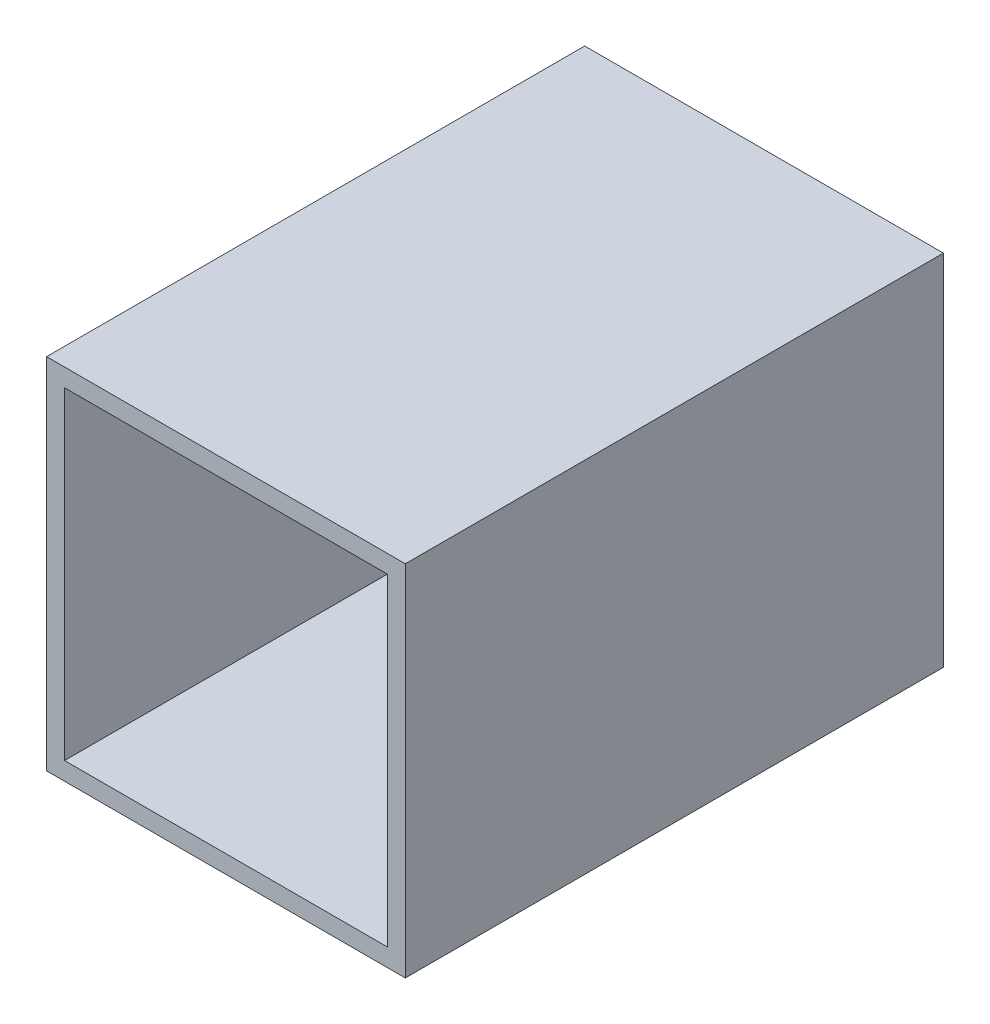
ISO-10303-21;
HEADER;
FILE_DESCRIPTION(('STEP AP214'),'2;1');
FILE_NAME('part.step','',(''),(''),'','','');
FILE_SCHEMA(('AUTOMOTIVE_DESIGN { 1 0 10303 214 1 1 1 1 }'));
ENDSEC;
DATA;
#1=APPLICATION_CONTEXT('core data for automotive mechanical design processes');
#2=APPLICATION_PROTOCOL_DEFINITION('international standard','automotive_design',2000,#1);
#3=PRODUCT_CONTEXT('',#1,'mechanical');
#4=PRODUCT('Part','Part','',(#3));
#5=PRODUCT_RELATED_PRODUCT_CATEGORY('part','',(#4));
#6=PRODUCT_DEFINITION_FORMATION('','',#4);
#7=PRODUCT_DEFINITION_CONTEXT('part definition',#1,'design');
#8=PRODUCT_DEFINITION('design','',#6,#7);
#9=PRODUCT_DEFINITION_SHAPE('','',#8);
#10=(LENGTH_UNIT() NAMED_UNIT(*) SI_UNIT(.MILLI.,.METRE.));
#11=(NAMED_UNIT(*) PLANE_ANGLE_UNIT() SI_UNIT($,.RADIAN.));
#12=(NAMED_UNIT(*) SI_UNIT($,.STERADIAN.) SOLID_ANGLE_UNIT());
#13=UNCERTAINTY_MEASURE_WITH_UNIT(LENGTH_MEASURE(1.E-05),#10,'distance_accuracy_value','');
#14=(GEOMETRIC_REPRESENTATION_CONTEXT(3) GLOBAL_UNCERTAINTY_ASSIGNED_CONTEXT((#13)) GLOBAL_UNIT_ASSIGNED_CONTEXT((#10,
#11,#12)) REPRESENTATION_CONTEXT('',''));
#15=CARTESIAN_POINT('',(0.,0.,0.));
#16=DIRECTION('',(0.,0.,1.));
#17=DIRECTION('',(1.,0.,0.));
#18=AXIS2_PLACEMENT_3D('',#15,#16,#17);
#19=CARTESIAN_POINT('',(0.,0.,30.));
#20=DIRECTION('',(0.,0.,1.));
#21=DIRECTION('',(1.,0.,0.));
#22=AXIS2_PLACEMENT_3D('',#19,#20,#21);
#23=PLANE('',#22);
#24=DIRECTION('',(0.,-1.,0.));
#25=VECTOR('',#24,1.);
#26=CARTESIAN_POINT('',(-10.,-10.,30.));
#27=LINE('',#26,#25);
#28=CARTESIAN_POINT('',(-10.,10.,30.));
#29=VERTEX_POINT('',#28);
#30=CARTESIAN_POINT('',(-10.,-10.,30.));
#31=VERTEX_POINT('',#30);
#32=EDGE_CURVE('E153',#29,#31,#27,.T.);
#33=ORIENTED_EDGE('',*,*,#32,.T.);
#34=DIRECTION('',(1.,0.,0.));
#35=VECTOR('',#34,1.);
#36=CARTESIAN_POINT('',(10.,-10.,30.));
#37=LINE('',#36,#35);
#38=CARTESIAN_POINT('',(10.,-10.,30.));
#39=VERTEX_POINT('',#38);
#40=EDGE_CURVE('E157',#31,#39,#37,.T.);
#41=ORIENTED_EDGE('',*,*,#40,.T.);
#42=DIRECTION('',(0.,1.,0.));
#43=VECTOR('',#42,1.);
#44=CARTESIAN_POINT('',(10.,-10.,30.));
#45=LINE('',#44,#43);
#46=CARTESIAN_POINT('',(10.,10.,30.));
#47=VERTEX_POINT('',#46);
#48=EDGE_CURVE('E161',#39,#47,#45,.T.);
#49=ORIENTED_EDGE('',*,*,#48,.T.);
#50=DIRECTION('',(-1.,0.,0.));
#51=VECTOR('',#50,1.);
#52=CARTESIAN_POINT('',(10.,10.,30.));
#53=LINE('',#52,#51);
#54=EDGE_CURVE('E164',#47,#29,#53,.T.);
#55=ORIENTED_EDGE('',*,*,#54,.T.);
#56=EDGE_LOOP('',(#33,#41,#49,#55));
#57=FACE_BOUND('',#56,.T.);
#58=DIRECTION('',(-1.,0.,0.));
#59=VECTOR('',#58,1.);
#60=CARTESIAN_POINT('',(9.,9.,30.));
#61=LINE('',#60,#59);
#62=CARTESIAN_POINT('',(9.,9.,30.));
#63=VERTEX_POINT('',#62);
#64=CARTESIAN_POINT('',(-9.,9.,30.));
#65=VERTEX_POINT('',#64);
#66=EDGE_CURVE('E114',#63,#65,#61,.T.);
#67=ORIENTED_EDGE('',*,*,#66,.F.);
#68=DIRECTION('',(0.,1.,0.));
#69=VECTOR('',#68,1.);
#70=CARTESIAN_POINT('',(9.,-9.,30.));
#71=LINE('',#70,#69);
#72=CARTESIAN_POINT('',(9.,-9.,30.));
#73=VERTEX_POINT('',#72);
#74=EDGE_CURVE('E105',#73,#63,#71,.T.);
#75=ORIENTED_EDGE('',*,*,#74,.F.);
#76=DIRECTION('',(1.,0.,0.));
#77=VECTOR('',#76,1.);
#78=CARTESIAN_POINT('',(9.,-9.,30.));
#79=LINE('',#78,#77);
#80=CARTESIAN_POINT('',(-9.,-9.,30.));
#81=VERTEX_POINT('',#80);
#82=EDGE_CURVE('E131',#81,#73,#79,.T.);
#83=ORIENTED_EDGE('',*,*,#82,.F.);
#84=DIRECTION('',(0.,-1.,0.));
#85=VECTOR('',#84,1.);
#86=CARTESIAN_POINT('',(-9.,-9.,30.));
#87=LINE('',#86,#85);
#88=EDGE_CURVE('E127',#65,#81,#87,.T.);
#89=ORIENTED_EDGE('',*,*,#88,.F.);
#90=EDGE_LOOP('',(#67,#75,#83,#89));
#91=FACE_BOUND('',#90,.T.);
#92=ADVANCED_FACE('F39',(#57,#91),#23,.T.);
#93=CARTESIAN_POINT('',(0.,0.,0.));
#94=DIRECTION('',(0.,0.,1.));
#95=DIRECTION('',(1.,0.,0.));
#96=AXIS2_PLACEMENT_3D('',#93,#94,#95);
#97=PLANE('',#96);
#98=DIRECTION('',(0.,-1.,0.));
#99=VECTOR('',#98,1.);
#100=CARTESIAN_POINT('',(-10.,-10.,0.));
#101=LINE('',#100,#99);
#102=CARTESIAN_POINT('',(-10.,10.,0.));
#103=VERTEX_POINT('',#102);
#104=CARTESIAN_POINT('',(-10.,-10.,0.));
#105=VERTEX_POINT('',#104);
#106=EDGE_CURVE('E123',#103,#105,#101,.T.);
#107=ORIENTED_EDGE('',*,*,#106,.F.);
#108=DIRECTION('',(-1.,0.,0.));
#109=VECTOR('',#108,1.);
#110=CARTESIAN_POINT('',(10.,10.,0.));
#111=LINE('',#110,#109);
#112=CARTESIAN_POINT('',(10.,10.,0.));
#113=VERTEX_POINT('',#112);
#114=EDGE_CURVE('E158',#113,#103,#111,.T.);
#115=ORIENTED_EDGE('',*,*,#114,.F.);
#116=DIRECTION('',(0.,1.,0.));
#117=VECTOR('',#116,1.);
#118=CARTESIAN_POINT('',(10.,-10.,0.));
#119=LINE('',#118,#117);
#120=CARTESIAN_POINT('',(10.,-10.,0.));
#121=VERTEX_POINT('',#120);
#122=EDGE_CURVE('E174',#121,#113,#119,.T.);
#123=ORIENTED_EDGE('',*,*,#122,.F.);
#124=DIRECTION('',(1.,0.,0.));
#125=VECTOR('',#124,1.);
#126=CARTESIAN_POINT('',(10.,-10.,0.));
#127=LINE('',#126,#125);
#128=EDGE_CURVE('E171',#105,#121,#127,.T.);
#129=ORIENTED_EDGE('',*,*,#128,.F.);
#130=EDGE_LOOP('',(#107,#115,#123,#129));
#131=FACE_BOUND('',#130,.T.);
#132=DIRECTION('',(0.,1.,0.));
#133=VECTOR('',#132,1.);
#134=CARTESIAN_POINT('',(9.,-9.,0.));
#135=LINE('',#134,#133);
#136=CARTESIAN_POINT('',(9.,-9.,0.));
#137=VERTEX_POINT('',#136);
#138=CARTESIAN_POINT('',(9.,9.,0.));
#139=VERTEX_POINT('',#138);
#140=EDGE_CURVE('E63',#137,#139,#135,.T.);
#141=ORIENTED_EDGE('',*,*,#140,.T.);
#142=DIRECTION('',(-1.,0.,0.));
#143=VECTOR('',#142,1.);
#144=CARTESIAN_POINT('',(9.,9.,0.));
#145=LINE('',#144,#143);
#146=CARTESIAN_POINT('',(-9.,9.,0.));
#147=VERTEX_POINT('',#146);
#148=EDGE_CURVE('E121',#139,#147,#145,.T.);
#149=ORIENTED_EDGE('',*,*,#148,.T.);
#150=DIRECTION('',(0.,-1.,0.));
#151=VECTOR('',#150,1.);
#152=CARTESIAN_POINT('',(-9.,-9.,0.));
#153=LINE('',#152,#151);
#154=CARTESIAN_POINT('',(-9.,-9.,0.));
#155=VERTEX_POINT('',#154);
#156=EDGE_CURVE('E140',#147,#155,#153,.T.);
#157=ORIENTED_EDGE('',*,*,#156,.T.);
#158=DIRECTION('',(1.,0.,0.));
#159=VECTOR('',#158,1.);
#160=CARTESIAN_POINT('',(9.,-9.,0.));
#161=LINE('',#160,#159);
#162=EDGE_CURVE('E115',#155,#137,#161,.T.);
#163=ORIENTED_EDGE('',*,*,#162,.T.);
#164=EDGE_LOOP('',(#141,#149,#157,#163));
#165=FACE_BOUND('',#164,.T.);
#166=ADVANCED_FACE('F197',(#131,#165),#97,.F.);
#167=CARTESIAN_POINT('',(-10.,-10.,30.));
#168=DIRECTION('',(1.,0.,0.));
#169=DIRECTION('',(0.,0.,-1.));
#170=AXIS2_PLACEMENT_3D('',#167,#168,#169);
#171=PLANE('',#170);
#172=ORIENTED_EDGE('',*,*,#106,.T.);
#173=DIRECTION('',(0.,0.,-1.));
#174=VECTOR('',#173,1.);
#175=CARTESIAN_POINT('',(-10.,-10.,30.));
#176=LINE('',#175,#174);
#177=EDGE_CURVE('E11',#31,#105,#176,.T.);
#178=ORIENTED_EDGE('',*,*,#177,.F.);
#179=ORIENTED_EDGE('',*,*,#32,.F.);
#180=DIRECTION('',(0.,0.,-1.));
#181=VECTOR('',#180,1.);
#182=CARTESIAN_POINT('',(-10.,10.,30.));
#183=LINE('',#182,#181);
#184=EDGE_CURVE('E167',#29,#103,#183,.T.);
#185=ORIENTED_EDGE('',*,*,#184,.T.);
#186=EDGE_LOOP('',(#172,#178,#179,#185));
#187=FACE_BOUND('',#186,.T.);
#188=ADVANCED_FACE('F41',(#187),#171,.F.);
#189=CARTESIAN_POINT('',(10.,-10.,30.));
#190=DIRECTION('',(0.,1.,0.));
#191=DIRECTION('',(0.,0.,1.));
#192=AXIS2_PLACEMENT_3D('',#189,#190,#191);
#193=PLANE('',#192);
#194=ORIENTED_EDGE('',*,*,#128,.T.);
#195=DIRECTION('',(0.,0.,-1.));
#196=VECTOR('',#195,1.);
#197=CARTESIAN_POINT('',(10.,-10.,30.));
#198=LINE('',#197,#196);
#199=EDGE_CURVE('E48',#39,#121,#198,.T.);
#200=ORIENTED_EDGE('',*,*,#199,.F.);
#201=ORIENTED_EDGE('',*,*,#40,.F.);
#202=ORIENTED_EDGE('',*,*,#177,.T.);
#203=EDGE_LOOP('',(#194,#200,#201,#202));
#204=FACE_BOUND('',#203,.T.);
#205=ADVANCED_FACE('F207',(#204),#193,.F.);
#206=CARTESIAN_POINT('',(10.,-10.,30.));
#207=DIRECTION('',(-1.,0.,0.));
#208=DIRECTION('',(0.,0.,1.));
#209=AXIS2_PLACEMENT_3D('',#206,#207,#208);
#210=PLANE('',#209);
#211=ORIENTED_EDGE('',*,*,#122,.T.);
#212=DIRECTION('',(0.,0.,-1.));
#213=VECTOR('',#212,1.);
#214=CARTESIAN_POINT('',(10.,10.,30.));
#215=LINE('',#214,#213);
#216=EDGE_CURVE('E182',#47,#113,#215,.T.);
#217=ORIENTED_EDGE('',*,*,#216,.F.);
#218=ORIENTED_EDGE('',*,*,#48,.F.);
#219=ORIENTED_EDGE('',*,*,#199,.T.);
#220=EDGE_LOOP('',(#211,#217,#218,#219));
#221=FACE_BOUND('',#220,.T.);
#222=ADVANCED_FACE('F191',(#221),#210,.F.);
#223=CARTESIAN_POINT('',(10.,10.,30.));
#224=DIRECTION('',(0.,-1.,0.));
#225=DIRECTION('',(1.,0.,0.));
#226=AXIS2_PLACEMENT_3D('',#223,#224,#225);
#227=PLANE('',#226);
#228=ORIENTED_EDGE('',*,*,#114,.T.);
#229=ORIENTED_EDGE('',*,*,#184,.F.);
#230=ORIENTED_EDGE('',*,*,#54,.F.);
#231=ORIENTED_EDGE('',*,*,#216,.T.);
#232=EDGE_LOOP('',(#228,#229,#230,#231));
#233=FACE_BOUND('',#232,.T.);
#234=ADVANCED_FACE('F201',(#233),#227,.F.);
#235=CARTESIAN_POINT('',(9.,-9.,30.));
#236=DIRECTION('',(-1.,0.,0.));
#237=DIRECTION('',(0.,0.,1.));
#238=AXIS2_PLACEMENT_3D('',#235,#236,#237);
#239=PLANE('',#238);
#240=ORIENTED_EDGE('',*,*,#140,.F.);
#241=DIRECTION('',(0.,0.,-1.));
#242=VECTOR('',#241,1.);
#243=CARTESIAN_POINT('',(9.,-9.,30.));
#244=LINE('',#243,#242);
#245=EDGE_CURVE('E109',#73,#137,#244,.T.);
#246=ORIENTED_EDGE('',*,*,#245,.F.);
#247=ORIENTED_EDGE('',*,*,#74,.T.);
#248=DIRECTION('',(0.,0.,-1.));
#249=VECTOR('',#248,1.);
#250=CARTESIAN_POINT('',(9.,9.,30.));
#251=LINE('',#250,#249);
#252=EDGE_CURVE('E108',#63,#139,#251,.T.);
#253=ORIENTED_EDGE('',*,*,#252,.T.);
#254=EDGE_LOOP('',(#240,#246,#247,#253));
#255=FACE_BOUND('',#254,.T.);
#256=ADVANCED_FACE('F107',(#255),#239,.T.);
#257=CARTESIAN_POINT('',(9.,9.,30.));
#258=DIRECTION('',(0.,-1.,0.));
#259=DIRECTION('',(1.,0.,0.));
#260=AXIS2_PLACEMENT_3D('',#257,#258,#259);
#261=PLANE('',#260);
#262=ORIENTED_EDGE('',*,*,#148,.F.);
#263=ORIENTED_EDGE('',*,*,#252,.F.);
#264=ORIENTED_EDGE('',*,*,#66,.T.);
#265=DIRECTION('',(0.,0.,-1.));
#266=VECTOR('',#265,1.);
#267=CARTESIAN_POINT('',(-9.,9.,30.));
#268=LINE('',#267,#266);
#269=EDGE_CURVE('E124',#65,#147,#268,.T.);
#270=ORIENTED_EDGE('',*,*,#269,.T.);
#271=EDGE_LOOP('',(#262,#263,#264,#270));
#272=FACE_BOUND('',#271,.T.);
#273=ADVANCED_FACE('F118',(#272),#261,.T.);
#274=CARTESIAN_POINT('',(-9.,-9.,30.));
#275=DIRECTION('',(1.,0.,0.));
#276=DIRECTION('',(0.,1.,0.));
#277=AXIS2_PLACEMENT_3D('',#274,#275,#276);
#278=PLANE('',#277);
#279=ORIENTED_EDGE('',*,*,#156,.F.);
#280=ORIENTED_EDGE('',*,*,#269,.F.);
#281=ORIENTED_EDGE('',*,*,#88,.T.);
#282=DIRECTION('',(0.,0.,-1.));
#283=VECTOR('',#282,1.);
#284=CARTESIAN_POINT('',(-9.,-9.,30.));
#285=LINE('',#284,#283);
#286=EDGE_CURVE('E55',#81,#155,#285,.T.);
#287=ORIENTED_EDGE('',*,*,#286,.T.);
#288=EDGE_LOOP('',(#279,#280,#281,#287));
#289=FACE_BOUND('',#288,.T.);
#290=ADVANCED_FACE('F230',(#289),#278,.T.);
#291=CARTESIAN_POINT('',(9.,-9.,30.));
#292=DIRECTION('',(0.,1.,0.));
#293=DIRECTION('',(-1.,0.,0.));
#294=AXIS2_PLACEMENT_3D('',#291,#292,#293);
#295=PLANE('',#294);
#296=ORIENTED_EDGE('',*,*,#162,.F.);
#297=ORIENTED_EDGE('',*,*,#286,.F.);
#298=ORIENTED_EDGE('',*,*,#82,.T.);
#299=ORIENTED_EDGE('',*,*,#245,.T.);
#300=EDGE_LOOP('',(#296,#297,#298,#299));
#301=FACE_BOUND('',#300,.T.);
#302=ADVANCED_FACE('F234',(#301),#295,.T.);
#303=CLOSED_SHELL('',(#92,#166,#188,#205,#222,#234,#256,#273,#290,#302));
#304=MANIFOLD_SOLID_BREP('B2',#303);
#305=ADVANCED_BREP_SHAPE_REPRESENTATION('',(#18,#304),#14);
#306=SHAPE_DEFINITION_REPRESENTATION(#9,#305);
ENDSEC;
END-ISO-10303-21;
